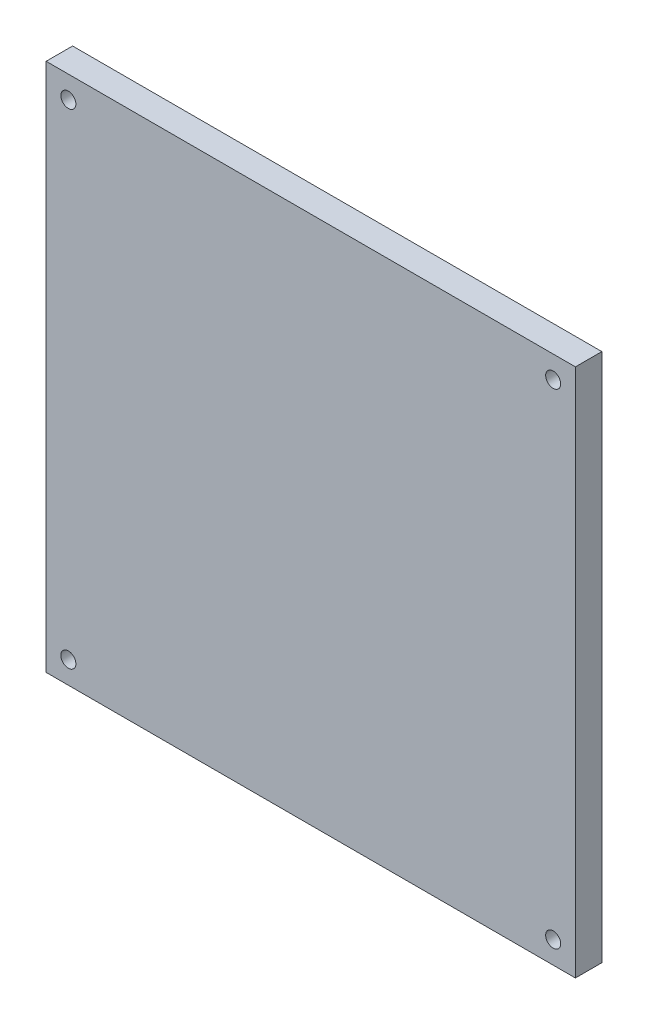
ISO-10303-21;
HEADER;
FILE_DESCRIPTION(('STEP AP214'),'2;1');
FILE_NAME('part.step','',(''),(''),'','','');
FILE_SCHEMA(('AUTOMOTIVE_DESIGN { 1 0 10303 214 1 1 1 1 }'));
ENDSEC;
DATA;
#1=APPLICATION_CONTEXT('core data for automotive mechanical design processes');
#2=APPLICATION_PROTOCOL_DEFINITION('international standard','automotive_design',2000,#1);
#3=PRODUCT_CONTEXT('',#1,'mechanical');
#4=PRODUCT('Part','Part','',(#3));
#5=PRODUCT_RELATED_PRODUCT_CATEGORY('part','',(#4));
#6=PRODUCT_DEFINITION_FORMATION('','',#4);
#7=PRODUCT_DEFINITION_CONTEXT('part definition',#1,'design');
#8=PRODUCT_DEFINITION('design','',#6,#7);
#9=PRODUCT_DEFINITION_SHAPE('','',#8);
#10=(LENGTH_UNIT() NAMED_UNIT(*) SI_UNIT(.MILLI.,.METRE.));
#11=(NAMED_UNIT(*) PLANE_ANGLE_UNIT() SI_UNIT($,.RADIAN.));
#12=(NAMED_UNIT(*) SI_UNIT($,.STERADIAN.) SOLID_ANGLE_UNIT());
#13=UNCERTAINTY_MEASURE_WITH_UNIT(LENGTH_MEASURE(1.E-05),#10,'distance_accuracy_value','');
#14=(GEOMETRIC_REPRESENTATION_CONTEXT(3) GLOBAL_UNCERTAINTY_ASSIGNED_CONTEXT((#13)) GLOBAL_UNIT_ASSIGNED_CONTEXT((#10,
#11,#12)) REPRESENTATION_CONTEXT('',''));
#15=CARTESIAN_POINT('',(0.,0.,0.));
#16=DIRECTION('',(0.,0.,1.));
#17=DIRECTION('',(1.,0.,0.));
#18=AXIS2_PLACEMENT_3D('',#15,#16,#17);
#19=CARTESIAN_POINT('',(50.,50.,5.));
#20=DIRECTION('',(-1.,0.,0.));
#21=DIRECTION('',(0.,-1.,0.));
#22=AXIS2_PLACEMENT_3D('',#19,#20,#21);
#23=PLANE('',#22);
#24=DIRECTION('',(0.,1.,0.));
#25=VECTOR('',#24,1.);
#26=CARTESIAN_POINT('',(50.,50.,0.));
#27=LINE('',#26,#25);
#28=CARTESIAN_POINT('',(50.,-50.,0.));
#29=VERTEX_POINT('',#28);
#30=CARTESIAN_POINT('',(50.,50.,0.));
#31=VERTEX_POINT('',#30);
#32=EDGE_CURVE('E113',#29,#31,#27,.T.);
#33=ORIENTED_EDGE('',*,*,#32,.T.);
#34=DIRECTION('',(0.,0.,-1.));
#35=VECTOR('',#34,1.);
#36=CARTESIAN_POINT('',(50.,50.,5.));
#37=LINE('',#36,#35);
#38=CARTESIAN_POINT('',(50.,50.,5.));
#39=VERTEX_POINT('',#38);
#40=EDGE_CURVE('E11',#39,#31,#37,.T.);
#41=ORIENTED_EDGE('',*,*,#40,.F.);
#42=DIRECTION('',(0.,1.,0.));
#43=VECTOR('',#42,1.);
#44=CARTESIAN_POINT('',(50.,50.,5.));
#45=LINE('',#44,#43);
#46=CARTESIAN_POINT('',(50.,-50.,5.));
#47=VERTEX_POINT('',#46);
#48=EDGE_CURVE('E97',#47,#39,#45,.T.);
#49=ORIENTED_EDGE('',*,*,#48,.F.);
#50=DIRECTION('',(0.,0.,-1.));
#51=VECTOR('',#50,1.);
#52=CARTESIAN_POINT('',(50.,-50.,5.));
#53=LINE('',#52,#51);
#54=EDGE_CURVE('E109',#47,#29,#53,.T.);
#55=ORIENTED_EDGE('',*,*,#54,.T.);
#56=EDGE_LOOP('',(#33,#41,#49,#55));
#57=FACE_BOUND('',#56,.T.);
#58=ADVANCED_FACE('F45',(#57),#23,.F.);
#59=CARTESIAN_POINT('',(-50.,50.,5.));
#60=DIRECTION('',(0.,-1.,0.));
#61=DIRECTION('',(0.,0.,-1.));
#62=AXIS2_PLACEMENT_3D('',#59,#60,#61);
#63=PLANE('',#62);
#64=DIRECTION('',(-1.,0.,0.));
#65=VECTOR('',#64,1.);
#66=CARTESIAN_POINT('',(-50.,50.,0.));
#67=LINE('',#66,#65);
#68=CARTESIAN_POINT('',(-50.,50.,0.));
#69=VERTEX_POINT('',#68);
#70=EDGE_CURVE('E102',#31,#69,#67,.T.);
#71=ORIENTED_EDGE('',*,*,#70,.T.);
#72=DIRECTION('',(0.,0.,-1.));
#73=VECTOR('',#72,1.);
#74=CARTESIAN_POINT('',(-50.,50.,5.));
#75=LINE('',#74,#73);
#76=CARTESIAN_POINT('',(-50.,50.,5.));
#77=VERTEX_POINT('',#76);
#78=EDGE_CURVE('E54',#77,#69,#75,.T.);
#79=ORIENTED_EDGE('',*,*,#78,.F.);
#80=DIRECTION('',(-1.,0.,0.));
#81=VECTOR('',#80,1.);
#82=CARTESIAN_POINT('',(-50.,50.,5.));
#83=LINE('',#82,#81);
#84=EDGE_CURVE('E92',#39,#77,#83,.T.);
#85=ORIENTED_EDGE('',*,*,#84,.F.);
#86=ORIENTED_EDGE('',*,*,#40,.T.);
#87=EDGE_LOOP('',(#71,#79,#85,#86));
#88=FACE_BOUND('',#87,.T.);
#89=ADVANCED_FACE('F101',(#88),#63,.F.);
#90=CARTESIAN_POINT('',(-50.,50.,5.));
#91=DIRECTION('',(1.,0.,0.));
#92=DIRECTION('',(0.,1.,0.));
#93=AXIS2_PLACEMENT_3D('',#90,#91,#92);
#94=PLANE('',#93);
#95=DIRECTION('',(0.,-1.,0.));
#96=VECTOR('',#95,1.);
#97=CARTESIAN_POINT('',(-50.,50.,0.));
#98=LINE('',#97,#96);
#99=CARTESIAN_POINT('',(-50.,-50.,0.));
#100=VERTEX_POINT('',#99);
#101=EDGE_CURVE('E79',#69,#100,#98,.T.);
#102=ORIENTED_EDGE('',*,*,#101,.T.);
#103=DIRECTION('',(0.,0.,-1.));
#104=VECTOR('',#103,1.);
#105=CARTESIAN_POINT('',(-50.,-50.,5.));
#106=LINE('',#105,#104);
#107=CARTESIAN_POINT('',(-50.,-50.,5.));
#108=VERTEX_POINT('',#107);
#109=EDGE_CURVE('E104',#108,#100,#106,.T.);
#110=ORIENTED_EDGE('',*,*,#109,.F.);
#111=DIRECTION('',(0.,-1.,0.));
#112=VECTOR('',#111,1.);
#113=CARTESIAN_POINT('',(-50.,50.,5.));
#114=LINE('',#113,#112);
#115=EDGE_CURVE('E95',#77,#108,#114,.T.);
#116=ORIENTED_EDGE('',*,*,#115,.F.);
#117=ORIENTED_EDGE('',*,*,#78,.T.);
#118=EDGE_LOOP('',(#102,#110,#116,#117));
#119=FACE_BOUND('',#118,.T.);
#120=ADVANCED_FACE('F105',(#119),#94,.F.);
#121=CARTESIAN_POINT('',(-50.,-50.,5.));
#122=DIRECTION('',(0.,1.,0.));
#123=DIRECTION('',(0.,0.,1.));
#124=AXIS2_PLACEMENT_3D('',#121,#122,#123);
#125=PLANE('',#124);
#126=DIRECTION('',(1.,0.,0.));
#127=VECTOR('',#126,1.);
#128=CARTESIAN_POINT('',(-50.,-50.,0.));
#129=LINE('',#128,#127);
#130=EDGE_CURVE('E85',#100,#29,#129,.T.);
#131=ORIENTED_EDGE('',*,*,#130,.T.);
#132=ORIENTED_EDGE('',*,*,#54,.F.);
#133=DIRECTION('',(1.,0.,0.));
#134=VECTOR('',#133,1.);
#135=CARTESIAN_POINT('',(-50.,-50.,5.));
#136=LINE('',#135,#134);
#137=EDGE_CURVE('E62',#108,#47,#136,.T.);
#138=ORIENTED_EDGE('',*,*,#137,.F.);
#139=ORIENTED_EDGE('',*,*,#109,.T.);
#140=EDGE_LOOP('',(#131,#132,#138,#139));
#141=FACE_BOUND('',#140,.T.);
#142=ADVANCED_FACE('F127',(#141),#125,.F.);
#143=CARTESIAN_POINT('',(0.,0.,5.));
#144=DIRECTION('',(0.,0.,1.));
#145=DIRECTION('',(1.,0.,0.));
#146=AXIS2_PLACEMENT_3D('',#143,#144,#145);
#147=PLANE('',#146);
#148=CARTESIAN_POINT('',(45.8,45.8,5.));
#149=DIRECTION('',(0.,0.,1.));
#150=DIRECTION('',(1.,0.,0.));
#151=AXIS2_PLACEMENT_3D('',#148,#149,#150);
#152=CIRCLE('',#151,1.42);
#153=CARTESIAN_POINT('',(47.22,45.8,5.));
#154=VERTEX_POINT('',#153);
#155=EDGE_CURVE('E146',#154,#154,#152,.T.);
#156=ORIENTED_EDGE('',*,*,#155,.F.);
#157=EDGE_LOOP('',(#156));
#158=FACE_BOUND('',#157,.T.);
#159=CARTESIAN_POINT('',(45.8,-45.8,5.));
#160=DIRECTION('',(0.,0.,1.));
#161=DIRECTION('',(1.,0.,0.));
#162=AXIS2_PLACEMENT_3D('',#159,#160,#161);
#163=CIRCLE('',#162,1.42);
#164=CARTESIAN_POINT('',(47.22,-45.8,5.));
#165=VERTEX_POINT('',#164);
#166=EDGE_CURVE('E154',#165,#165,#163,.T.);
#167=ORIENTED_EDGE('',*,*,#166,.F.);
#168=EDGE_LOOP('',(#167));
#169=FACE_BOUND('',#168,.T.);
#170=CARTESIAN_POINT('',(-45.8,-45.8,5.));
#171=DIRECTION('',(0.,0.,1.));
#172=DIRECTION('',(1.,0.,0.));
#173=AXIS2_PLACEMENT_3D('',#170,#171,#172);
#174=CIRCLE('',#173,1.42);
#175=CARTESIAN_POINT('',(-44.38,-45.8,5.));
#176=VERTEX_POINT('',#175);
#177=EDGE_CURVE('E138',#176,#176,#174,.T.);
#178=ORIENTED_EDGE('',*,*,#177,.F.);
#179=EDGE_LOOP('',(#178));
#180=FACE_BOUND('',#179,.T.);
#181=CARTESIAN_POINT('',(-45.8,45.8,5.));
#182=DIRECTION('',(0.,0.,1.));
#183=DIRECTION('',(1.,0.,0.));
#184=AXIS2_PLACEMENT_3D('',#181,#182,#183);
#185=CIRCLE('',#184,1.42);
#186=CARTESIAN_POINT('',(-44.38,45.8,5.));
#187=VERTEX_POINT('',#186);
#188=EDGE_CURVE('E134',#187,#187,#185,.T.);
#189=ORIENTED_EDGE('',*,*,#188,.F.);
#190=EDGE_LOOP('',(#189));
#191=FACE_BOUND('',#190,.T.);
#192=ORIENTED_EDGE('',*,*,#48,.T.);
#193=ORIENTED_EDGE('',*,*,#84,.T.);
#194=ORIENTED_EDGE('',*,*,#115,.T.);
#195=ORIENTED_EDGE('',*,*,#137,.T.);
#196=EDGE_LOOP('',(#192,#193,#194,#195));
#197=FACE_BOUND('',#196,.T.);
#198=ADVANCED_FACE('F93',(#158,#169,#180,#191,#197),#147,.T.);
#199=CARTESIAN_POINT('',(0.,0.,0.));
#200=DIRECTION('',(0.,0.,1.));
#201=DIRECTION('',(1.,0.,0.));
#202=AXIS2_PLACEMENT_3D('',#199,#200,#201);
#203=PLANE('',#202);
#204=CARTESIAN_POINT('',(45.8,45.8,0.));
#205=DIRECTION('',(0.,0.,1.));
#206=DIRECTION('',(1.,0.,0.));
#207=AXIS2_PLACEMENT_3D('',#204,#205,#206);
#208=CIRCLE('',#207,1.42);
#209=CARTESIAN_POINT('',(47.22,45.8,0.));
#210=VERTEX_POINT('',#209);
#211=EDGE_CURVE('E142',#210,#210,#208,.T.);
#212=ORIENTED_EDGE('',*,*,#211,.T.);
#213=EDGE_LOOP('',(#212));
#214=FACE_BOUND('',#213,.T.);
#215=CARTESIAN_POINT('',(45.8,-45.8,0.));
#216=DIRECTION('',(0.,0.,1.));
#217=DIRECTION('',(1.,0.,0.));
#218=AXIS2_PLACEMENT_3D('',#215,#216,#217);
#219=CIRCLE('',#218,1.42);
#220=CARTESIAN_POINT('',(47.22,-45.8,0.));
#221=VERTEX_POINT('',#220);
#222=EDGE_CURVE('E150',#221,#221,#219,.T.);
#223=ORIENTED_EDGE('',*,*,#222,.T.);
#224=EDGE_LOOP('',(#223));
#225=FACE_BOUND('',#224,.T.);
#226=CARTESIAN_POINT('',(-45.8,-45.8,0.));
#227=DIRECTION('',(0.,0.,1.));
#228=DIRECTION('',(1.,0.,0.));
#229=AXIS2_PLACEMENT_3D('',#226,#227,#228);
#230=CIRCLE('',#229,1.42);
#231=CARTESIAN_POINT('',(-44.38,-45.8,0.));
#232=VERTEX_POINT('',#231);
#233=EDGE_CURVE('E158',#232,#232,#230,.T.);
#234=ORIENTED_EDGE('',*,*,#233,.T.);
#235=EDGE_LOOP('',(#234));
#236=FACE_BOUND('',#235,.T.);
#237=CARTESIAN_POINT('',(-45.8,45.8,0.));
#238=DIRECTION('',(0.,0.,1.));
#239=DIRECTION('',(1.,0.,0.));
#240=AXIS2_PLACEMENT_3D('',#237,#238,#239);
#241=CIRCLE('',#240,1.42);
#242=CARTESIAN_POINT('',(-44.38,45.8,0.));
#243=VERTEX_POINT('',#242);
#244=EDGE_CURVE('E117',#243,#243,#241,.T.);
#245=ORIENTED_EDGE('',*,*,#244,.T.);
#246=EDGE_LOOP('',(#245));
#247=FACE_BOUND('',#246,.T.);
#248=ORIENTED_EDGE('',*,*,#32,.F.);
#249=ORIENTED_EDGE('',*,*,#130,.F.);
#250=ORIENTED_EDGE('',*,*,#101,.F.);
#251=ORIENTED_EDGE('',*,*,#70,.F.);
#252=EDGE_LOOP('',(#248,#249,#250,#251));
#253=FACE_BOUND('',#252,.T.);
#254=ADVANCED_FACE('F130',(#214,#225,#236,#247,#253),#203,.F.);
#255=CARTESIAN_POINT('',(-45.8,45.8,0.));
#256=DIRECTION('',(0.,0.,1.));
#257=DIRECTION('',(1.,0.,0.));
#258=AXIS2_PLACEMENT_3D('',#255,#256,#257);
#259=CYLINDRICAL_SURFACE('',#258,1.42);
#260=ORIENTED_EDGE('',*,*,#244,.F.);
#261=EDGE_LOOP('',(#260));
#262=FACE_BOUND('',#261,.T.);
#263=ORIENTED_EDGE('',*,*,#188,.T.);
#264=EDGE_LOOP('',(#263));
#265=FACE_BOUND('',#264,.T.);
#266=ADVANCED_FACE('F174',(#262,#265),#259,.F.);
#267=CARTESIAN_POINT('',(-45.8,-45.8,0.));
#268=DIRECTION('',(0.,0.,1.));
#269=DIRECTION('',(1.,0.,0.));
#270=AXIS2_PLACEMENT_3D('',#267,#268,#269);
#271=CYLINDRICAL_SURFACE('',#270,1.42);
#272=ORIENTED_EDGE('',*,*,#233,.F.);
#273=EDGE_LOOP('',(#272));
#274=FACE_BOUND('',#273,.T.);
#275=ORIENTED_EDGE('',*,*,#177,.T.);
#276=EDGE_LOOP('',(#275));
#277=FACE_BOUND('',#276,.T.);
#278=ADVANCED_FACE('F166',(#274,#277),#271,.F.);
#279=CARTESIAN_POINT('',(45.8,-45.8,0.));
#280=DIRECTION('',(0.,0.,1.));
#281=DIRECTION('',(1.,0.,0.));
#282=AXIS2_PLACEMENT_3D('',#279,#280,#281);
#283=CYLINDRICAL_SURFACE('',#282,1.42);
#284=ORIENTED_EDGE('',*,*,#222,.F.);
#285=EDGE_LOOP('',(#284));
#286=FACE_BOUND('',#285,.T.);
#287=ORIENTED_EDGE('',*,*,#166,.T.);
#288=EDGE_LOOP('',(#287));
#289=FACE_BOUND('',#288,.T.);
#290=ADVANCED_FACE('F182',(#286,#289),#283,.F.);
#291=CARTESIAN_POINT('',(45.8,45.8,0.));
#292=DIRECTION('',(0.,0.,1.));
#293=DIRECTION('',(1.,0.,0.));
#294=AXIS2_PLACEMENT_3D('',#291,#292,#293);
#295=CYLINDRICAL_SURFACE('',#294,1.42);
#296=ORIENTED_EDGE('',*,*,#211,.F.);
#297=EDGE_LOOP('',(#296));
#298=FACE_BOUND('',#297,.T.);
#299=ORIENTED_EDGE('',*,*,#155,.T.);
#300=EDGE_LOOP('',(#299));
#301=FACE_BOUND('',#300,.T.);
#302=ADVANCED_FACE('F233',(#298,#301),#295,.F.);
#303=CLOSED_SHELL('',(#58,#89,#120,#142,#198,#254,#266,#278,#290,#302));
#304=MANIFOLD_SOLID_BREP('B2',#303);
#305=ADVANCED_BREP_SHAPE_REPRESENTATION('',(#18,#304),#14);
#306=SHAPE_DEFINITION_REPRESENTATION(#9,#305);
ENDSEC;
END-ISO-10303-21;
